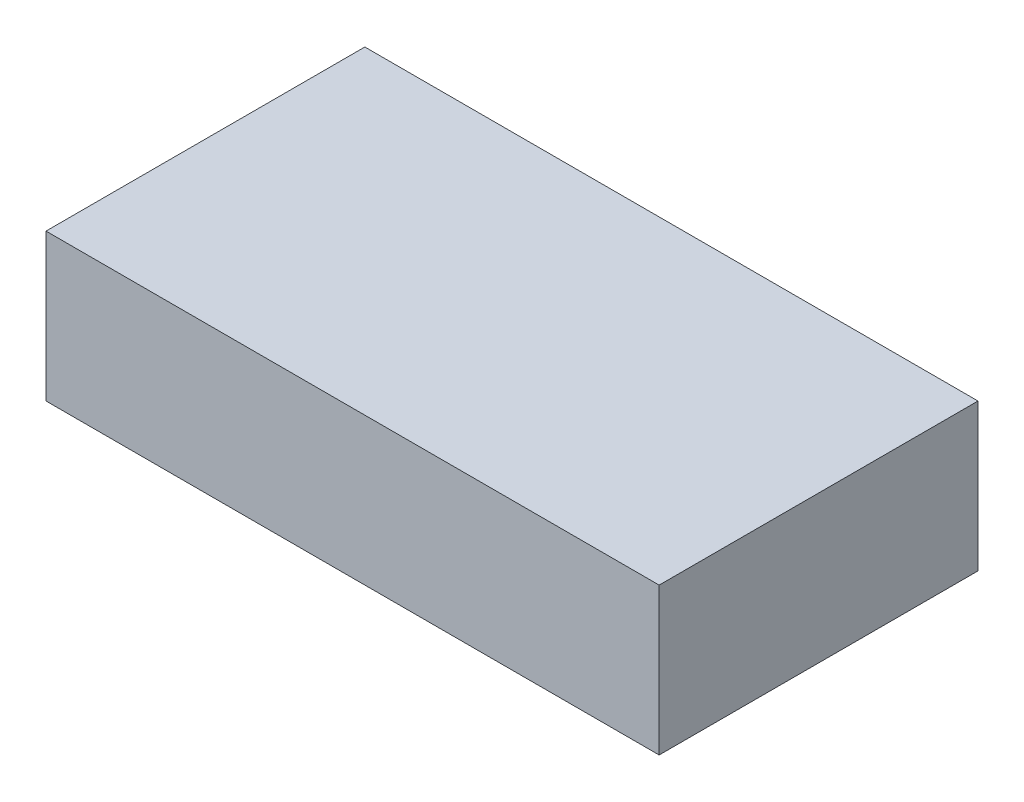
ISO-10303-21;
HEADER;
FILE_DESCRIPTION(('STEP AP214'),'2;1');
FILE_NAME('part.step','',(''),(''),'','','');
FILE_SCHEMA(('AUTOMOTIVE_DESIGN { 1 0 10303 214 1 1 1 1 }'));
ENDSEC;
DATA;
#1=APPLICATION_CONTEXT('core data for automotive mechanical design processes');
#2=APPLICATION_PROTOCOL_DEFINITION('international standard','automotive_design',2000,#1);
#3=PRODUCT_CONTEXT('',#1,'mechanical');
#4=PRODUCT('Part','Part','',(#3));
#5=PRODUCT_RELATED_PRODUCT_CATEGORY('part','',(#4));
#6=PRODUCT_DEFINITION_FORMATION('','',#4);
#7=PRODUCT_DEFINITION_CONTEXT('part definition',#1,'design');
#8=PRODUCT_DEFINITION('design','',#6,#7);
#9=PRODUCT_DEFINITION_SHAPE('','',#8);
#10=(LENGTH_UNIT() NAMED_UNIT(*) SI_UNIT(.MILLI.,.METRE.));
#11=(NAMED_UNIT(*) PLANE_ANGLE_UNIT() SI_UNIT($,.RADIAN.));
#12=(NAMED_UNIT(*) SI_UNIT($,.STERADIAN.) SOLID_ANGLE_UNIT());
#13=UNCERTAINTY_MEASURE_WITH_UNIT(LENGTH_MEASURE(1.E-05),#10,'distance_accuracy_value','');
#14=(GEOMETRIC_REPRESENTATION_CONTEXT(3) GLOBAL_UNCERTAINTY_ASSIGNED_CONTEXT((#13)) GLOBAL_UNIT_ASSIGNED_CONTEXT((#10,
#11,#12)) REPRESENTATION_CONTEXT('',''));
#15=CARTESIAN_POINT('',(0.,0.,0.));
#16=DIRECTION('',(0.,0.,1.));
#17=DIRECTION('',(1.,0.,0.));
#18=AXIS2_PLACEMENT_3D('',#15,#16,#17);
#19=CARTESIAN_POINT('',(0.,6.,0.));
#20=DIRECTION('',(1.,0.,0.));
#21=DIRECTION('',(0.,0.,-1.));
#22=AXIS2_PLACEMENT_3D('',#19,#20,#21);
#23=PLANE('',#22);
#24=DIRECTION('',(0.,0.,1.));
#25=VECTOR('',#24,1.);
#26=CARTESIAN_POINT('',(0.,0.,0.));
#27=LINE('',#26,#25);
#28=CARTESIAN_POINT('',(0.,0.,-13.));
#29=VERTEX_POINT('',#28);
#30=CARTESIAN_POINT('',(0.,0.,0.));
#31=VERTEX_POINT('',#30);
#32=EDGE_CURVE('E101',#29,#31,#27,.T.);
#33=ORIENTED_EDGE('',*,*,#32,.T.);
#34=DIRECTION('',(0.,-1.,0.));
#35=VECTOR('',#34,1.);
#36=CARTESIAN_POINT('',(0.,6.,0.));
#37=LINE('',#36,#35);
#38=CARTESIAN_POINT('',(0.,6.,0.));
#39=VERTEX_POINT('',#38);
#40=EDGE_CURVE('E11',#39,#31,#37,.T.);
#41=ORIENTED_EDGE('',*,*,#40,.F.);
#42=DIRECTION('',(0.,0.,1.));
#43=VECTOR('',#42,1.);
#44=CARTESIAN_POINT('',(0.,6.,0.));
#45=LINE('',#44,#43);
#46=CARTESIAN_POINT('',(0.,6.,-13.));
#47=VERTEX_POINT('',#46);
#48=EDGE_CURVE('E95',#47,#39,#45,.T.);
#49=ORIENTED_EDGE('',*,*,#48,.F.);
#50=DIRECTION('',(0.,-1.,0.));
#51=VECTOR('',#50,1.);
#52=CARTESIAN_POINT('',(0.,6.,-13.));
#53=LINE('',#52,#51);
#54=EDGE_CURVE('E99',#47,#29,#53,.T.);
#55=ORIENTED_EDGE('',*,*,#54,.T.);
#56=EDGE_LOOP('',(#33,#41,#49,#55));
#57=FACE_BOUND('',#56,.T.);
#58=ADVANCED_FACE('F41',(#57),#23,.F.);
#59=CARTESIAN_POINT('',(0.,6.,0.));
#60=DIRECTION('',(0.,0.,-1.));
#61=DIRECTION('',(-1.,0.,0.));
#62=AXIS2_PLACEMENT_3D('',#59,#60,#61);
#63=PLANE('',#62);
#64=DIRECTION('',(1.,0.,0.));
#65=VECTOR('',#64,1.);
#66=CARTESIAN_POINT('',(0.,0.,0.));
#67=LINE('',#66,#65);
#68=CARTESIAN_POINT('',(25.,0.,0.));
#69=VERTEX_POINT('',#68);
#70=EDGE_CURVE('E96',#31,#69,#67,.T.);
#71=ORIENTED_EDGE('',*,*,#70,.T.);
#72=DIRECTION('',(0.,-1.,0.));
#73=VECTOR('',#72,1.);
#74=CARTESIAN_POINT('',(25.,6.,0.));
#75=LINE('',#74,#73);
#76=CARTESIAN_POINT('',(25.,6.,0.));
#77=VERTEX_POINT('',#76);
#78=EDGE_CURVE('E47',#77,#69,#75,.T.);
#79=ORIENTED_EDGE('',*,*,#78,.F.);
#80=DIRECTION('',(1.,0.,0.));
#81=VECTOR('',#80,1.);
#82=CARTESIAN_POINT('',(0.,6.,0.));
#83=LINE('',#82,#81);
#84=EDGE_CURVE('E90',#39,#77,#83,.T.);
#85=ORIENTED_EDGE('',*,*,#84,.F.);
#86=ORIENTED_EDGE('',*,*,#40,.T.);
#87=EDGE_LOOP('',(#71,#79,#85,#86));
#88=FACE_BOUND('',#87,.T.);
#89=ADVANCED_FACE('F94',(#88),#63,.F.);
#90=CARTESIAN_POINT('',(25.,6.,0.));
#91=DIRECTION('',(-1.,0.,0.));
#92=DIRECTION('',(0.,0.,1.));
#93=AXIS2_PLACEMENT_3D('',#90,#91,#92);
#94=PLANE('',#93);
#95=DIRECTION('',(0.,0.,-1.));
#96=VECTOR('',#95,1.);
#97=CARTESIAN_POINT('',(25.,0.,0.));
#98=LINE('',#97,#96);
#99=CARTESIAN_POINT('',(25.,0.,-13.));
#100=VERTEX_POINT('',#99);
#101=EDGE_CURVE('E72',#69,#100,#98,.T.);
#102=ORIENTED_EDGE('',*,*,#101,.T.);
#103=DIRECTION('',(0.,-1.,0.));
#104=VECTOR('',#103,1.);
#105=CARTESIAN_POINT('',(25.,6.,-13.));
#106=LINE('',#105,#104);
#107=CARTESIAN_POINT('',(25.,6.,-13.));
#108=VERTEX_POINT('',#107);
#109=EDGE_CURVE('E100',#108,#100,#106,.T.);
#110=ORIENTED_EDGE('',*,*,#109,.F.);
#111=DIRECTION('',(0.,0.,-1.));
#112=VECTOR('',#111,1.);
#113=CARTESIAN_POINT('',(25.,6.,0.));
#114=LINE('',#113,#112);
#115=EDGE_CURVE('E89',#77,#108,#114,.T.);
#116=ORIENTED_EDGE('',*,*,#115,.F.);
#117=ORIENTED_EDGE('',*,*,#78,.T.);
#118=EDGE_LOOP('',(#102,#110,#116,#117));
#119=FACE_BOUND('',#118,.T.);
#120=ADVANCED_FACE('F97',(#119),#94,.F.);
#121=CARTESIAN_POINT('',(0.,6.,-13.));
#122=DIRECTION('',(0.,0.,1.));
#123=DIRECTION('',(1.,0.,0.));
#124=AXIS2_PLACEMENT_3D('',#121,#122,#123);
#125=PLANE('',#124);
#126=DIRECTION('',(-1.,0.,0.));
#127=VECTOR('',#126,1.);
#128=CARTESIAN_POINT('',(0.,0.,-13.));
#129=LINE('',#128,#127);
#130=EDGE_CURVE('E79',#100,#29,#129,.T.);
#131=ORIENTED_EDGE('',*,*,#130,.T.);
#132=ORIENTED_EDGE('',*,*,#54,.F.);
#133=DIRECTION('',(-1.,0.,0.));
#134=VECTOR('',#133,1.);
#135=CARTESIAN_POINT('',(0.,6.,-13.));
#136=LINE('',#135,#134);
#137=EDGE_CURVE('E60',#108,#47,#136,.T.);
#138=ORIENTED_EDGE('',*,*,#137,.F.);
#139=ORIENTED_EDGE('',*,*,#109,.T.);
#140=EDGE_LOOP('',(#131,#132,#138,#139));
#141=FACE_BOUND('',#140,.T.);
#142=ADVANCED_FACE('F112',(#141),#125,.F.);
#143=CARTESIAN_POINT('',(0.,6.,0.));
#144=DIRECTION('',(0.,-1.,0.));
#145=DIRECTION('',(0.,0.,-1.));
#146=AXIS2_PLACEMENT_3D('',#143,#144,#145);
#147=PLANE('',#146);
#148=ORIENTED_EDGE('',*,*,#48,.T.);
#149=ORIENTED_EDGE('',*,*,#84,.T.);
#150=ORIENTED_EDGE('',*,*,#115,.T.);
#151=ORIENTED_EDGE('',*,*,#137,.T.);
#152=EDGE_LOOP('',(#148,#149,#150,#151));
#153=FACE_BOUND('',#152,.T.);
#154=ADVANCED_FACE('F88',(#153),#147,.F.);
#155=CARTESIAN_POINT('',(0.,0.,0.));
#156=DIRECTION('',(0.,-1.,0.));
#157=DIRECTION('',(0.,0.,-1.));
#158=AXIS2_PLACEMENT_3D('',#155,#156,#157);
#159=PLANE('',#158);
#160=ORIENTED_EDGE('',*,*,#32,.F.);
#161=ORIENTED_EDGE('',*,*,#130,.F.);
#162=ORIENTED_EDGE('',*,*,#101,.F.);
#163=ORIENTED_EDGE('',*,*,#70,.F.);
#164=EDGE_LOOP('',(#160,#161,#162,#163));
#165=FACE_BOUND('',#164,.T.);
#166=ADVANCED_FACE('F114',(#165),#159,.T.);
#167=CLOSED_SHELL('',(#58,#89,#120,#142,#154,#166));
#168=MANIFOLD_SOLID_BREP('B2',#167);
#169=ADVANCED_BREP_SHAPE_REPRESENTATION('',(#18,#168),#14);
#170=SHAPE_DEFINITION_REPRESENTATION(#9,#169);
ENDSEC;
END-ISO-10303-21;
